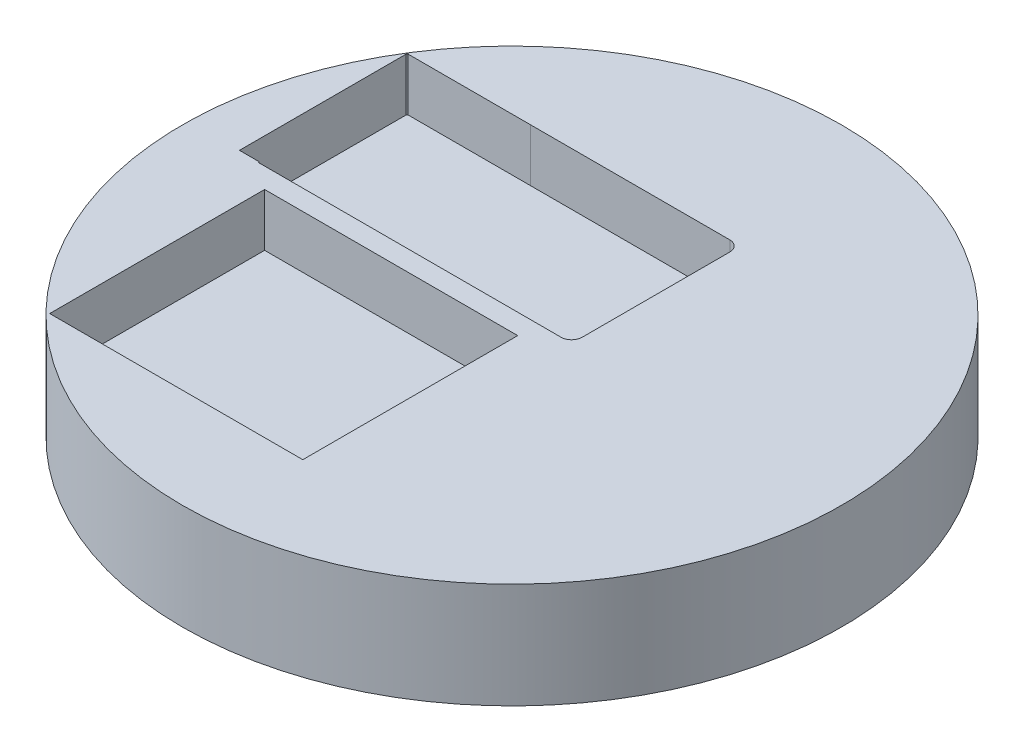
ISO-10303-21;
HEADER;
FILE_DESCRIPTION(('STEP AP214'),'2;1');
FILE_NAME('part.step','',(''),(''),'','','');
FILE_SCHEMA(('AUTOMOTIVE_DESIGN { 1 0 10303 214 1 1 1 1 }'));
ENDSEC;
DATA;
#1=APPLICATION_CONTEXT('core data for automotive mechanical design processes');
#2=APPLICATION_PROTOCOL_DEFINITION('international standard','automotive_design',2000,#1);
#3=PRODUCT_CONTEXT('',#1,'mechanical');
#4=PRODUCT('Part','Part','',(#3));
#5=PRODUCT_RELATED_PRODUCT_CATEGORY('part','',(#4));
#6=PRODUCT_DEFINITION_FORMATION('','',#4);
#7=PRODUCT_DEFINITION_CONTEXT('part definition',#1,'design');
#8=PRODUCT_DEFINITION('design','',#6,#7);
#9=PRODUCT_DEFINITION_SHAPE('','',#8);
#10=(LENGTH_UNIT() NAMED_UNIT(*) SI_UNIT(.MILLI.,.METRE.));
#11=(NAMED_UNIT(*) PLANE_ANGLE_UNIT() SI_UNIT($,.RADIAN.));
#12=(NAMED_UNIT(*) SI_UNIT($,.STERADIAN.) SOLID_ANGLE_UNIT());
#13=UNCERTAINTY_MEASURE_WITH_UNIT(LENGTH_MEASURE(1.E-05),#10,'distance_accuracy_value','');
#14=(GEOMETRIC_REPRESENTATION_CONTEXT(3) GLOBAL_UNCERTAINTY_ASSIGNED_CONTEXT((#13)) GLOBAL_UNIT_ASSIGNED_CONTEXT((#10,
#11,#12)) REPRESENTATION_CONTEXT('',''));
#15=CARTESIAN_POINT('',(0.,0.,0.));
#16=DIRECTION('',(0.,0.,1.));
#17=DIRECTION('',(1.,0.,0.));
#18=AXIS2_PLACEMENT_3D('',#15,#16,#17);
#19=CARTESIAN_POINT('',(0.,25.4,0.));
#20=DIRECTION('',(0.,1.,0.));
#21=DIRECTION('',(0.,0.,1.));
#22=AXIS2_PLACEMENT_3D('',#19,#20,#21);
#23=PLANE('',#22);
#24=CARTESIAN_POINT('',(0.,25.4,0.));
#25=DIRECTION('',(0.,1.,0.));
#26=DIRECTION('',(0.,0.,1.));
#27=AXIS2_PLACEMENT_3D('',#24,#25,#26);
#28=CIRCLE('',#27,79.375);
#29=CARTESIAN_POINT('',(0.,25.4,79.375));
#30=VERTEX_POINT('',#29);
#31=EDGE_CURVE('E11',#30,#30,#28,.T.);
#32=ORIENTED_EDGE('',*,*,#31,.T.);
#33=EDGE_LOOP('',(#32));
#34=FACE_BOUND('',#33,.T.);
#35=DIRECTION('',(-1.,0.,0.));
#36=VECTOR('',#35,1.);
#37=CARTESIAN_POINT('',(0.,25.4,3.58366160577653));
#38=LINE('',#37,#36);
#39=CARTESIAN_POINT('',(4.96096916966433,25.4,3.58366160577653));
#40=VERTEX_POINT('',#39);
#41=CARTESIAN_POINT('',(-55.9990308303357,25.4,3.58366160577653));
#42=VERTEX_POINT('',#41);
#43=EDGE_CURVE('E231',#40,#42,#38,.T.);
#44=ORIENTED_EDGE('',*,*,#43,.F.);
#45=DIRECTION('',(0.,0.,1.));
#46=VECTOR('',#45,1.);
#47=CARTESIAN_POINT('',(4.96096916966433,25.4,0.));
#48=LINE('',#47,#46);
#49=CARTESIAN_POINT('',(4.96096916966433,25.4,55.3488616057765));
#50=VERTEX_POINT('',#49);
#51=EDGE_CURVE('E56',#40,#50,#48,.T.);
#52=ORIENTED_EDGE('',*,*,#51,.T.);
#53=DIRECTION('',(1.,0.,0.));
#54=VECTOR('',#53,1.);
#55=CARTESIAN_POINT('',(0.,25.4,55.3488616057765));
#56=LINE('',#55,#54);
#57=CARTESIAN_POINT('',(-55.9990308303357,25.4,55.3488616057765));
#58=VERTEX_POINT('',#57);
#59=EDGE_CURVE('E221',#58,#50,#56,.T.);
#60=ORIENTED_EDGE('',*,*,#59,.F.);
#61=DIRECTION('',(0.,0.,-1.));
#62=VECTOR('',#61,1.);
#63=CARTESIAN_POINT('',(-55.9990308303357,25.4,0.));
#64=LINE('',#63,#62);
#65=EDGE_CURVE('E234',#58,#42,#64,.T.);
#66=ORIENTED_EDGE('',*,*,#65,.T.);
#67=EDGE_LOOP('',(#44,#52,#60,#66));
#68=FACE_BOUND('',#67,.T.);
#69=CARTESIAN_POINT('',(10.5298147641767,25.4,-39.3931383942235));
#70=DIRECTION('',(0.,1.,0.));
#71=DIRECTION('',(0.,0.,1.));
#72=AXIS2_PLACEMENT_3D('',#69,#70,#71);
#73=CIRCLE('',#72,2.54);
#74=CARTESIAN_POINT('',(13.0698147641767,25.4,-39.3931383942235));
#75=VERTEX_POINT('',#74);
#76=CARTESIAN_POINT('',(10.5298147641767,25.4,-41.9331383942235));
#77=VERTEX_POINT('',#76);
#78=EDGE_CURVE('E176',#75,#77,#73,.T.);
#79=ORIENTED_EDGE('',*,*,#78,.F.);
#80=DIRECTION('',(0.,0.,1.));
#81=VECTOR('',#80,1.);
#82=CARTESIAN_POINT('',(13.0698147641767,25.4,0.));
#83=LINE('',#82,#81);
#84=CARTESIAN_POINT('',(13.0698147641767,25.4,-3.83313839422347));
#85=VERTEX_POINT('',#84);
#86=EDGE_CURVE('E48',#75,#85,#83,.T.);
#87=ORIENTED_EDGE('',*,*,#86,.T.);
#88=CARTESIAN_POINT('',(10.5298147641767,25.4,-3.83313839422347));
#89=DIRECTION('',(0.,1.,0.));
#90=DIRECTION('',(0.,0.,1.));
#91=AXIS2_PLACEMENT_3D('',#88,#89,#90);
#92=CIRCLE('',#91,2.54);
#93=CARTESIAN_POINT('',(10.5298147641767,25.4,-1.29313839422347));
#94=VERTEX_POINT('',#93);
#95=EDGE_CURVE('E151',#94,#85,#92,.T.);
#96=ORIENTED_EDGE('',*,*,#95,.F.);
#97=DIRECTION('',(-1.,0.,0.));
#98=VECTOR('',#97,1.);
#99=CARTESIAN_POINT('',(0.,25.4,-1.29313839422347));
#100=LINE('',#99,#98);
#101=CARTESIAN_POINT('',(-62.3665883923683,25.4,-1.29313839422347));
#102=VERTEX_POINT('',#101);
#103=EDGE_CURVE('E196',#94,#102,#100,.T.);
#104=ORIENTED_EDGE('',*,*,#103,.T.);
#105=DIRECTION('',(0.231311725323147,0.,0.972879687180295));
#106=VECTOR('',#105,1.);
#107=CARTESIAN_POINT('',(-58.7386510563433,25.4,13.9656926730336));
#108=LINE('',#107,#106);
#109=CARTESIAN_POINT('',(-62.4269793934409,25.4,-1.54713839422346));
#110=VERTEX_POINT('',#109);
#111=EDGE_CURVE('E193',#110,#102,#108,.T.);
#112=ORIENTED_EDGE('',*,*,#111,.F.);
#113=DIRECTION('',(1.,0.,0.));
#114=VECTOR('',#113,1.);
#115=CARTESIAN_POINT('',(0.,25.4,-1.54713839422346));
#116=LINE('',#115,#114);
#117=CARTESIAN_POINT('',(-67.1938742659956,25.4,-1.54713839422346));
#118=VERTEX_POINT('',#117);
#119=EDGE_CURVE('E190',#118,#110,#116,.T.);
#120=ORIENTED_EDGE('',*,*,#119,.F.);
#121=DIRECTION('',(0.,0.,1.));
#122=VECTOR('',#121,1.);
#123=CARTESIAN_POINT('',(-67.1938742659956,25.4,0.));
#124=LINE('',#123,#122);
#125=CARTESIAN_POINT('',(-67.1938742659956,25.4,-41.6791384277293));
#126=VERTEX_POINT('',#125);
#127=EDGE_CURVE('E187',#126,#118,#124,.T.);
#128=ORIENTED_EDGE('',*,*,#127,.F.);
#129=DIRECTION('',(0.70711118800373,0.,-0.7071023743419));
#130=VECTOR('',#129,1.);
#131=CARTESIAN_POINT('',(-54.4360875795772,25.4,-54.4367660969811));
#132=LINE('',#131,#130);
#133=CARTESIAN_POINT('',(-66.9398750336421,25.4,-41.9331344941545));
#134=VERTEX_POINT('',#133);
#135=EDGE_CURVE('E184',#126,#134,#132,.T.);
#136=ORIENTED_EDGE('',*,*,#135,.T.);
#137=DIRECTION('',(0.999999999999991,0.,-1.323672573694E-07));
#138=VECTOR('',#137,1.);
#139=CARTESIAN_POINT('',(-5.550575178753E-06,25.4,-41.9331433548014));
#140=LINE('',#139,#138);
#141=CARTESIAN_POINT('',(-37.4758742659956,25.4,-41.9331383942235));
#142=VERTEX_POINT('',#141);
#143=EDGE_CURVE('E181',#134,#142,#140,.T.);
#144=ORIENTED_EDGE('',*,*,#143,.T.);
#145=DIRECTION('',(1.,0.,0.));
#146=VECTOR('',#145,1.);
#147=CARTESIAN_POINT('',(0.,25.4,-41.9331383942235));
#148=LINE('',#147,#146);
#149=EDGE_CURVE('E178',#142,#77,#148,.T.);
#150=ORIENTED_EDGE('',*,*,#149,.T.);
#151=EDGE_LOOP('',(#79,#87,#96,#104,#112,#120,#128,#136,#144,#150));
#152=FACE_BOUND('',#151,.T.);
#153=ADVANCED_FACE('F33',(#34,#68,#152),#23,.T.);
#154=CARTESIAN_POINT('',(0.,25.4,0.));
#155=DIRECTION('',(0.,-1.,0.));
#156=DIRECTION('',(0.,0.,-1.));
#157=AXIS2_PLACEMENT_3D('',#154,#155,#156);
#158=CYLINDRICAL_SURFACE('',#157,79.375);
#159=ORIENTED_EDGE('',*,*,#31,.F.);
#160=EDGE_LOOP('',(#159));
#161=FACE_BOUND('',#160,.T.);
#162=CARTESIAN_POINT('',(0.,0.,0.));
#163=DIRECTION('',(0.,1.,0.));
#164=DIRECTION('',(0.,0.,1.));
#165=AXIS2_PLACEMENT_3D('',#162,#163,#164);
#166=CIRCLE('',#165,79.375);
#167=CARTESIAN_POINT('',(0.,0.,79.375));
#168=VERTEX_POINT('',#167);
#169=EDGE_CURVE('E37',#168,#168,#166,.T.);
#170=ORIENTED_EDGE('',*,*,#169,.T.);
#171=EDGE_LOOP('',(#170));
#172=FACE_BOUND('',#171,.T.);
#173=ADVANCED_FACE('F35',(#161,#172),#158,.T.);
#174=CARTESIAN_POINT('',(0.,0.,0.));
#175=DIRECTION('',(0.,1.,0.));
#176=DIRECTION('',(0.,0.,1.));
#177=AXIS2_PLACEMENT_3D('',#174,#175,#176);
#178=PLANE('',#177);
#179=ORIENTED_EDGE('',*,*,#169,.F.);
#180=EDGE_LOOP('',(#179));
#181=FACE_BOUND('',#180,.T.);
#182=ADVANCED_FACE('F272',(#181),#178,.F.);
#183=CARTESIAN_POINT('',(4.96096916966433,12.7,0.));
#184=DIRECTION('',(-1.,0.,0.));
#185=DIRECTION('',(0.,0.,1.));
#186=AXIS2_PLACEMENT_3D('',#183,#184,#185);
#187=PLANE('',#186);
#188=ORIENTED_EDGE('',*,*,#51,.F.);
#189=DIRECTION('',(0.,1.,0.));
#190=VECTOR('',#189,1.);
#191=CARTESIAN_POINT('',(4.96096916966433,12.7,3.58366160577653));
#192=LINE('',#191,#190);
#193=CARTESIAN_POINT('',(4.96096916966433,12.7,3.58366160577653));
#194=VERTEX_POINT('',#193);
#195=EDGE_CURVE('E229',#194,#40,#192,.T.);
#196=ORIENTED_EDGE('',*,*,#195,.F.);
#197=DIRECTION('',(0.,0.,1.));
#198=VECTOR('',#197,1.);
#199=CARTESIAN_POINT('',(4.96096916966433,12.7,0.));
#200=LINE('',#199,#198);
#201=CARTESIAN_POINT('',(4.96096916966433,12.7,55.3488616057765));
#202=VERTEX_POINT('',#201);
#203=EDGE_CURVE('E218',#194,#202,#200,.T.);
#204=ORIENTED_EDGE('',*,*,#203,.T.);
#205=DIRECTION('',(0.,1.,0.));
#206=VECTOR('',#205,1.);
#207=CARTESIAN_POINT('',(4.96096916966433,12.7,55.3488616057765));
#208=LINE('',#207,#206);
#209=EDGE_CURVE('E239',#202,#50,#208,.T.);
#210=ORIENTED_EDGE('',*,*,#209,.T.);
#211=EDGE_LOOP('',(#188,#196,#204,#210));
#212=FACE_BOUND('',#211,.T.);
#213=ADVANCED_FACE('F262',(#212),#187,.T.);
#214=CARTESIAN_POINT('',(0.,12.7,55.3488616057765));
#215=DIRECTION('',(0.,0.,1.));
#216=DIRECTION('',(1.,0.,0.));
#217=AXIS2_PLACEMENT_3D('',#214,#215,#216);
#218=PLANE('',#217);
#219=ORIENTED_EDGE('',*,*,#59,.T.);
#220=ORIENTED_EDGE('',*,*,#209,.F.);
#221=DIRECTION('',(1.,0.,0.));
#222=VECTOR('',#221,1.);
#223=CARTESIAN_POINT('',(0.,12.7,55.3488616057765));
#224=LINE('',#223,#222);
#225=CARTESIAN_POINT('',(-55.9990308303357,12.7,55.3488616057765));
#226=VERTEX_POINT('',#225);
#227=EDGE_CURVE('E226',#226,#202,#224,.T.);
#228=ORIENTED_EDGE('',*,*,#227,.F.);
#229=DIRECTION('',(0.,1.,0.));
#230=VECTOR('',#229,1.);
#231=CARTESIAN_POINT('',(-55.9990308303357,12.7,55.3488616057765));
#232=LINE('',#231,#230);
#233=EDGE_CURVE('E241',#226,#58,#232,.T.);
#234=ORIENTED_EDGE('',*,*,#233,.T.);
#235=EDGE_LOOP('',(#219,#220,#228,#234));
#236=FACE_BOUND('',#235,.T.);
#237=ADVANCED_FACE('F264',(#236),#218,.F.);
#238=CARTESIAN_POINT('',(-55.9990308303357,12.7,0.));
#239=DIRECTION('',(1.,0.,0.));
#240=DIRECTION('',(0.,0.,-1.));
#241=AXIS2_PLACEMENT_3D('',#238,#239,#240);
#242=PLANE('',#241);
#243=ORIENTED_EDGE('',*,*,#65,.F.);
#244=ORIENTED_EDGE('',*,*,#233,.F.);
#245=DIRECTION('',(0.,0.,-1.));
#246=VECTOR('',#245,1.);
#247=CARTESIAN_POINT('',(-55.9990308303357,12.7,0.));
#248=LINE('',#247,#246);
#249=CARTESIAN_POINT('',(-55.9990308303357,12.7,3.58366160577653));
#250=VERTEX_POINT('',#249);
#251=EDGE_CURVE('E224',#226,#250,#248,.T.);
#252=ORIENTED_EDGE('',*,*,#251,.T.);
#253=DIRECTION('',(0.,1.,0.));
#254=VECTOR('',#253,1.);
#255=CARTESIAN_POINT('',(-55.9990308303357,12.7,3.58366160577653));
#256=LINE('',#255,#254);
#257=EDGE_CURVE('E243',#250,#42,#256,.T.);
#258=ORIENTED_EDGE('',*,*,#257,.T.);
#259=EDGE_LOOP('',(#243,#244,#252,#258));
#260=FACE_BOUND('',#259,.T.);
#261=ADVANCED_FACE('F256',(#260),#242,.T.);
#262=CARTESIAN_POINT('',(0.,12.7,3.58366160577653));
#263=DIRECTION('',(0.,0.,-1.));
#264=DIRECTION('',(-1.,0.,0.));
#265=AXIS2_PLACEMENT_3D('',#262,#263,#264);
#266=PLANE('',#265);
#267=ORIENTED_EDGE('',*,*,#43,.T.);
#268=ORIENTED_EDGE('',*,*,#257,.F.);
#269=DIRECTION('',(-1.,0.,0.));
#270=VECTOR('',#269,1.);
#271=CARTESIAN_POINT('',(0.,12.7,3.58366160577653));
#272=LINE('',#271,#270);
#273=EDGE_CURVE('E220',#194,#250,#272,.T.);
#274=ORIENTED_EDGE('',*,*,#273,.F.);
#275=ORIENTED_EDGE('',*,*,#195,.T.);
#276=EDGE_LOOP('',(#267,#268,#274,#275));
#277=FACE_BOUND('',#276,.T.);
#278=ADVANCED_FACE('F248',(#277),#266,.F.);
#279=CARTESIAN_POINT('',(0.,12.7,0.));
#280=DIRECTION('',(0.,1.,0.));
#281=DIRECTION('',(0.,0.,1.));
#282=AXIS2_PLACEMENT_3D('',#279,#280,#281);
#283=PLANE('',#282);
#284=ORIENTED_EDGE('',*,*,#203,.F.);
#285=ORIENTED_EDGE('',*,*,#273,.T.);
#286=ORIENTED_EDGE('',*,*,#251,.F.);
#287=ORIENTED_EDGE('',*,*,#227,.T.);
#288=EDGE_LOOP('',(#284,#285,#286,#287));
#289=FACE_BOUND('',#288,.T.);
#290=ADVANCED_FACE('F259',(#289),#283,.T.);
#291=CARTESIAN_POINT('',(13.0698147641767,12.7,0.));
#292=DIRECTION('',(-1.,0.,0.));
#293=DIRECTION('',(0.,0.,1.));
#294=AXIS2_PLACEMENT_3D('',#291,#292,#293);
#295=PLANE('',#294);
#296=ORIENTED_EDGE('',*,*,#86,.F.);
#297=DIRECTION('',(0.,1.,0.));
#298=VECTOR('',#297,1.);
#299=CARTESIAN_POINT('',(13.0698147641767,12.7,-39.3931383942235));
#300=LINE('',#299,#298);
#301=CARTESIAN_POINT('',(13.0698147641767,12.7,-39.3931383942235));
#302=VERTEX_POINT('',#301);
#303=EDGE_CURVE('E131',#302,#75,#300,.T.);
#304=ORIENTED_EDGE('',*,*,#303,.F.);
#305=DIRECTION('',(0.,0.,1.));
#306=VECTOR('',#305,1.);
#307=CARTESIAN_POINT('',(13.0698147641767,12.7,0.));
#308=LINE('',#307,#306);
#309=CARTESIAN_POINT('',(13.0698147641767,12.7,-3.83313839422347));
#310=VERTEX_POINT('',#309);
#311=EDGE_CURVE('E134',#302,#310,#308,.T.);
#312=ORIENTED_EDGE('',*,*,#311,.T.);
#313=DIRECTION('',(0.,1.,0.));
#314=VECTOR('',#313,1.);
#315=CARTESIAN_POINT('',(13.0698147641767,12.7,-3.83313839422347));
#316=LINE('',#315,#314);
#317=EDGE_CURVE('E201',#310,#85,#316,.T.);
#318=ORIENTED_EDGE('',*,*,#317,.T.);
#319=EDGE_LOOP('',(#296,#304,#312,#318));
#320=FACE_BOUND('',#319,.T.);
#321=ADVANCED_FACE('F133',(#320),#295,.T.);
#322=CARTESIAN_POINT('',(10.5298147641767,12.7,-3.83313839422347));
#323=DIRECTION('',(0.,1.,0.));
#324=DIRECTION('',(0.,0.,1.));
#325=AXIS2_PLACEMENT_3D('',#322,#323,#324);
#326=CYLINDRICAL_SURFACE('',#325,2.54);
#327=ORIENTED_EDGE('',*,*,#95,.T.);
#328=ORIENTED_EDGE('',*,*,#317,.F.);
#329=CARTESIAN_POINT('',(10.5298147641767,12.7,-3.83313839422347));
#330=DIRECTION('',(0.,1.,0.));
#331=DIRECTION('',(0.,0.,1.));
#332=AXIS2_PLACEMENT_3D('',#329,#330,#331);
#333=CIRCLE('',#332,2.54);
#334=CARTESIAN_POINT('',(10.5298147641767,12.7,-1.29313839422347));
#335=VERTEX_POINT('',#334);
#336=EDGE_CURVE('E141',#335,#310,#333,.T.);
#337=ORIENTED_EDGE('',*,*,#336,.F.);
#338=DIRECTION('',(0.,1.,0.));
#339=VECTOR('',#338,1.);
#340=CARTESIAN_POINT('',(10.5298147641767,12.7,-1.29313839422347));
#341=LINE('',#340,#339);
#342=EDGE_CURVE('E203',#335,#94,#341,.T.);
#343=ORIENTED_EDGE('',*,*,#342,.T.);
#344=EDGE_LOOP('',(#327,#328,#337,#343));
#345=FACE_BOUND('',#344,.T.);
#346=ADVANCED_FACE('F334',(#345),#326,.F.);
#347=CARTESIAN_POINT('',(0.,12.7,-1.29313839422347));
#348=DIRECTION('',(0.,0.,-1.));
#349=DIRECTION('',(-1.,0.,0.));
#350=AXIS2_PLACEMENT_3D('',#347,#348,#349);
#351=PLANE('',#350);
#352=ORIENTED_EDGE('',*,*,#103,.F.);
#353=ORIENTED_EDGE('',*,*,#342,.F.);
#354=DIRECTION('',(-1.,0.,0.));
#355=VECTOR('',#354,1.);
#356=CARTESIAN_POINT('',(0.,12.7,-1.29313839422347));
#357=LINE('',#356,#355);
#358=CARTESIAN_POINT('',(-62.3665883923683,12.7,-1.29313839422347));
#359=VERTEX_POINT('',#358);
#360=EDGE_CURVE('E172',#335,#359,#357,.T.);
#361=ORIENTED_EDGE('',*,*,#360,.T.);
#362=DIRECTION('',(0.,1.,0.));
#363=VECTOR('',#362,1.);
#364=CARTESIAN_POINT('',(-62.3665883923683,12.7,-1.29313839422347));
#365=LINE('',#364,#363);
#366=EDGE_CURVE('E205',#359,#102,#365,.T.);
#367=ORIENTED_EDGE('',*,*,#366,.T.);
#368=EDGE_LOOP('',(#352,#353,#361,#367));
#369=FACE_BOUND('',#368,.T.);
#370=ADVANCED_FACE('F343',(#369),#351,.T.);
#371=CARTESIAN_POINT('',(-58.7386510563433,12.7,13.9656926730336));
#372=DIRECTION('',(-0.972879687180295,0.,0.231311725323147));
#373=DIRECTION('',(0.231311725323147,0.,0.972879687180295));
#374=AXIS2_PLACEMENT_3D('',#371,#372,#373);
#375=PLANE('',#374);
#376=ORIENTED_EDGE('',*,*,#111,.T.);
#377=ORIENTED_EDGE('',*,*,#366,.F.);
#378=DIRECTION('',(0.231311725323147,0.,0.972879687180295));
#379=VECTOR('',#378,1.);
#380=CARTESIAN_POINT('',(-58.7386510563433,12.7,13.9656926730336));
#381=LINE('',#380,#379);
#382=CARTESIAN_POINT('',(-62.4269793934409,12.7,-1.54713839422346));
#383=VERTEX_POINT('',#382);
#384=EDGE_CURVE('E169',#383,#359,#381,.T.);
#385=ORIENTED_EDGE('',*,*,#384,.F.);
#386=DIRECTION('',(0.,1.,0.));
#387=VECTOR('',#386,1.);
#388=CARTESIAN_POINT('',(-62.4269793934409,12.7,-1.54713839422346));
#389=LINE('',#388,#387);
#390=EDGE_CURVE('E207',#383,#110,#389,.T.);
#391=ORIENTED_EDGE('',*,*,#390,.T.);
#392=EDGE_LOOP('',(#376,#377,#385,#391));
#393=FACE_BOUND('',#392,.T.);
#394=ADVANCED_FACE('F354',(#393),#375,.F.);
#395=CARTESIAN_POINT('',(0.,12.7,-1.54713839422346));
#396=DIRECTION('',(0.,0.,1.));
#397=DIRECTION('',(1.,0.,0.));
#398=AXIS2_PLACEMENT_3D('',#395,#396,#397);
#399=PLANE('',#398);
#400=ORIENTED_EDGE('',*,*,#119,.T.);
#401=ORIENTED_EDGE('',*,*,#390,.F.);
#402=DIRECTION('',(1.,0.,0.));
#403=VECTOR('',#402,1.);
#404=CARTESIAN_POINT('',(0.,12.7,-1.54713839422346));
#405=LINE('',#404,#403);
#406=CARTESIAN_POINT('',(-67.1938742659956,12.7,-1.54713839422346));
#407=VERTEX_POINT('',#406);
#408=EDGE_CURVE('E166',#407,#383,#405,.T.);
#409=ORIENTED_EDGE('',*,*,#408,.F.);
#410=DIRECTION('',(0.,1.,0.));
#411=VECTOR('',#410,1.);
#412=CARTESIAN_POINT('',(-67.1938742659956,12.7,-1.54713839422346));
#413=LINE('',#412,#411);
#414=EDGE_CURVE('E209',#407,#118,#413,.T.);
#415=ORIENTED_EDGE('',*,*,#414,.T.);
#416=EDGE_LOOP('',(#400,#401,#409,#415));
#417=FACE_BOUND('',#416,.T.);
#418=ADVANCED_FACE('F365',(#417),#399,.F.);
#419=CARTESIAN_POINT('',(-67.1938742659956,12.7,0.));
#420=DIRECTION('',(-1.,0.,0.));
#421=DIRECTION('',(0.,0.,1.));
#422=AXIS2_PLACEMENT_3D('',#419,#420,#421);
#423=PLANE('',#422);
#424=ORIENTED_EDGE('',*,*,#127,.T.);
#425=ORIENTED_EDGE('',*,*,#414,.F.);
#426=DIRECTION('',(0.,0.,1.));
#427=VECTOR('',#426,1.);
#428=CARTESIAN_POINT('',(-67.1938742659956,12.7,0.));
#429=LINE('',#428,#427);
#430=CARTESIAN_POINT('',(-67.1938742659956,12.7,-41.6791384277293));
#431=VERTEX_POINT('',#430);
#432=EDGE_CURVE('E163',#431,#407,#429,.T.);
#433=ORIENTED_EDGE('',*,*,#432,.F.);
#434=DIRECTION('',(0.,1.,0.));
#435=VECTOR('',#434,1.);
#436=CARTESIAN_POINT('',(-67.1938742659956,12.7,-41.6791384277293));
#437=LINE('',#436,#435);
#438=EDGE_CURVE('E211',#431,#126,#437,.T.);
#439=ORIENTED_EDGE('',*,*,#438,.T.);
#440=EDGE_LOOP('',(#424,#425,#433,#439));
#441=FACE_BOUND('',#440,.T.);
#442=ADVANCED_FACE('F375',(#441),#423,.F.);
#443=CARTESIAN_POINT('',(-54.4360875795772,12.7,-54.4367660969811));
#444=DIRECTION('',(0.7071023743419,0.,0.70711118800373));
#445=DIRECTION('',(0.707111188003731,0.,-0.7071023743419));
#446=AXIS2_PLACEMENT_3D('',#443,#444,#445);
#447=PLANE('',#446);
#448=ORIENTED_EDGE('',*,*,#135,.F.);
#449=ORIENTED_EDGE('',*,*,#438,.F.);
#450=DIRECTION('',(0.70711118800373,0.,-0.7071023743419));
#451=VECTOR('',#450,1.);
#452=CARTESIAN_POINT('',(-54.4360875795772,12.7,-54.4367660969811));
#453=LINE('',#452,#451);
#454=CARTESIAN_POINT('',(-66.9398750336421,12.7,-41.9331344941545));
#455=VERTEX_POINT('',#454);
#456=EDGE_CURVE('E161',#431,#455,#453,.T.);
#457=ORIENTED_EDGE('',*,*,#456,.T.);
#458=DIRECTION('',(0.,1.,0.));
#459=VECTOR('',#458,1.);
#460=CARTESIAN_POINT('',(-66.9398750336421,12.7,-41.9331344941545));
#461=LINE('',#460,#459);
#462=EDGE_CURVE('E213',#455,#134,#461,.T.);
#463=ORIENTED_EDGE('',*,*,#462,.T.);
#464=EDGE_LOOP('',(#448,#449,#457,#463));
#465=FACE_BOUND('',#464,.T.);
#466=ADVANCED_FACE('F386',(#465),#447,.T.);
#467=CARTESIAN_POINT('',(-5.550575178753E-06,12.7,-41.9331433548014));
#468=DIRECTION('',(1.323672573694E-07,0.,0.999999999999991));
#469=DIRECTION('',(0.999999999999991,0.,-1.323672573694E-07));
#470=AXIS2_PLACEMENT_3D('',#467,#468,#469);
#471=PLANE('',#470);
#472=ORIENTED_EDGE('',*,*,#143,.F.);
#473=ORIENTED_EDGE('',*,*,#462,.F.);
#474=DIRECTION('',(0.999999999999991,0.,-1.323672573694E-07));
#475=VECTOR('',#474,1.);
#476=CARTESIAN_POINT('',(-5.550575178753E-06,12.7,-41.9331433548014));
#477=LINE('',#476,#475);
#478=CARTESIAN_POINT('',(-37.4758742659956,12.7,-41.9331383942235));
#479=VERTEX_POINT('',#478);
#480=EDGE_CURVE('E157',#455,#479,#477,.T.);
#481=ORIENTED_EDGE('',*,*,#480,.T.);
#482=DIRECTION('',(0.,1.,0.));
#483=VECTOR('',#482,1.);
#484=CARTESIAN_POINT('',(-37.4758742659956,12.7,-41.9331383942235));
#485=LINE('',#484,#483);
#486=EDGE_CURVE('E215',#479,#142,#485,.T.);
#487=ORIENTED_EDGE('',*,*,#486,.T.);
#488=EDGE_LOOP('',(#472,#473,#481,#487));
#489=FACE_BOUND('',#488,.T.);
#490=ADVANCED_FACE('F397',(#489),#471,.T.);
#491=CARTESIAN_POINT('',(0.,12.7,-41.9331383942235));
#492=DIRECTION('',(0.,0.,1.));
#493=DIRECTION('',(1.,0.,0.));
#494=AXIS2_PLACEMENT_3D('',#491,#492,#493);
#495=PLANE('',#494);
#496=ORIENTED_EDGE('',*,*,#149,.F.);
#497=ORIENTED_EDGE('',*,*,#486,.F.);
#498=DIRECTION('',(1.,0.,0.));
#499=VECTOR('',#498,1.);
#500=CARTESIAN_POINT('',(0.,12.7,-41.9331383942235));
#501=LINE('',#500,#499);
#502=CARTESIAN_POINT('',(10.5298147641767,12.7,-41.9331383942235));
#503=VERTEX_POINT('',#502);
#504=EDGE_CURVE('E155',#479,#503,#501,.T.);
#505=ORIENTED_EDGE('',*,*,#504,.T.);
#506=DIRECTION('',(0.,1.,0.));
#507=VECTOR('',#506,1.);
#508=CARTESIAN_POINT('',(10.5298147641767,12.7,-41.9331383942235));
#509=LINE('',#508,#507);
#510=EDGE_CURVE('E140',#503,#77,#509,.T.);
#511=ORIENTED_EDGE('',*,*,#510,.T.);
#512=EDGE_LOOP('',(#496,#497,#505,#511));
#513=FACE_BOUND('',#512,.T.);
#514=ADVANCED_FACE('F408',(#513),#495,.T.);
#515=CARTESIAN_POINT('',(10.5298147641767,12.7,-39.3931383942235));
#516=DIRECTION('',(0.,1.,0.));
#517=DIRECTION('',(0.,0.,1.));
#518=AXIS2_PLACEMENT_3D('',#515,#516,#517);
#519=CYLINDRICAL_SURFACE('',#518,2.54);
#520=ORIENTED_EDGE('',*,*,#78,.T.);
#521=ORIENTED_EDGE('',*,*,#510,.F.);
#522=CARTESIAN_POINT('',(10.5298147641767,12.7,-39.3931383942235));
#523=DIRECTION('',(0.,1.,0.));
#524=DIRECTION('',(0.,0.,1.));
#525=AXIS2_PLACEMENT_3D('',#522,#523,#524);
#526=CIRCLE('',#525,2.54);
#527=EDGE_CURVE('E148',#302,#503,#526,.T.);
#528=ORIENTED_EDGE('',*,*,#527,.F.);
#529=ORIENTED_EDGE('',*,*,#303,.T.);
#530=EDGE_LOOP('',(#520,#521,#528,#529));
#531=FACE_BOUND('',#530,.T.);
#532=ADVANCED_FACE('F154',(#531),#519,.F.);
#533=CARTESIAN_POINT('',(0.,12.7,0.));
#534=DIRECTION('',(0.,1.,0.));
#535=DIRECTION('',(0.,0.,1.));
#536=AXIS2_PLACEMENT_3D('',#533,#534,#535);
#537=PLANE('',#536);
#538=ORIENTED_EDGE('',*,*,#311,.F.);
#539=ORIENTED_EDGE('',*,*,#527,.T.);
#540=ORIENTED_EDGE('',*,*,#504,.F.);
#541=ORIENTED_EDGE('',*,*,#480,.F.);
#542=ORIENTED_EDGE('',*,*,#456,.F.);
#543=ORIENTED_EDGE('',*,*,#432,.T.);
#544=ORIENTED_EDGE('',*,*,#408,.T.);
#545=ORIENTED_EDGE('',*,*,#384,.T.);
#546=ORIENTED_EDGE('',*,*,#360,.F.);
#547=ORIENTED_EDGE('',*,*,#336,.T.);
#548=EDGE_LOOP('',(#538,#539,#540,#541,#542,#543,#544,#545,#546,#547));
#549=FACE_BOUND('',#548,.T.);
#550=ADVANCED_FACE('F146',(#549),#537,.T.);
#551=CLOSED_SHELL('',(#153,#173,#182,#213,#237,#261,#278,#290,#321,#346,#370,#394,#418,#442,
#466,#490,#514,#532,#550));
#552=MANIFOLD_SOLID_BREP('B2',#551);
#553=ADVANCED_BREP_SHAPE_REPRESENTATION('',(#18,#552),#14);
#554=SHAPE_DEFINITION_REPRESENTATION(#9,#553);
ENDSEC;
END-ISO-10303-21;
